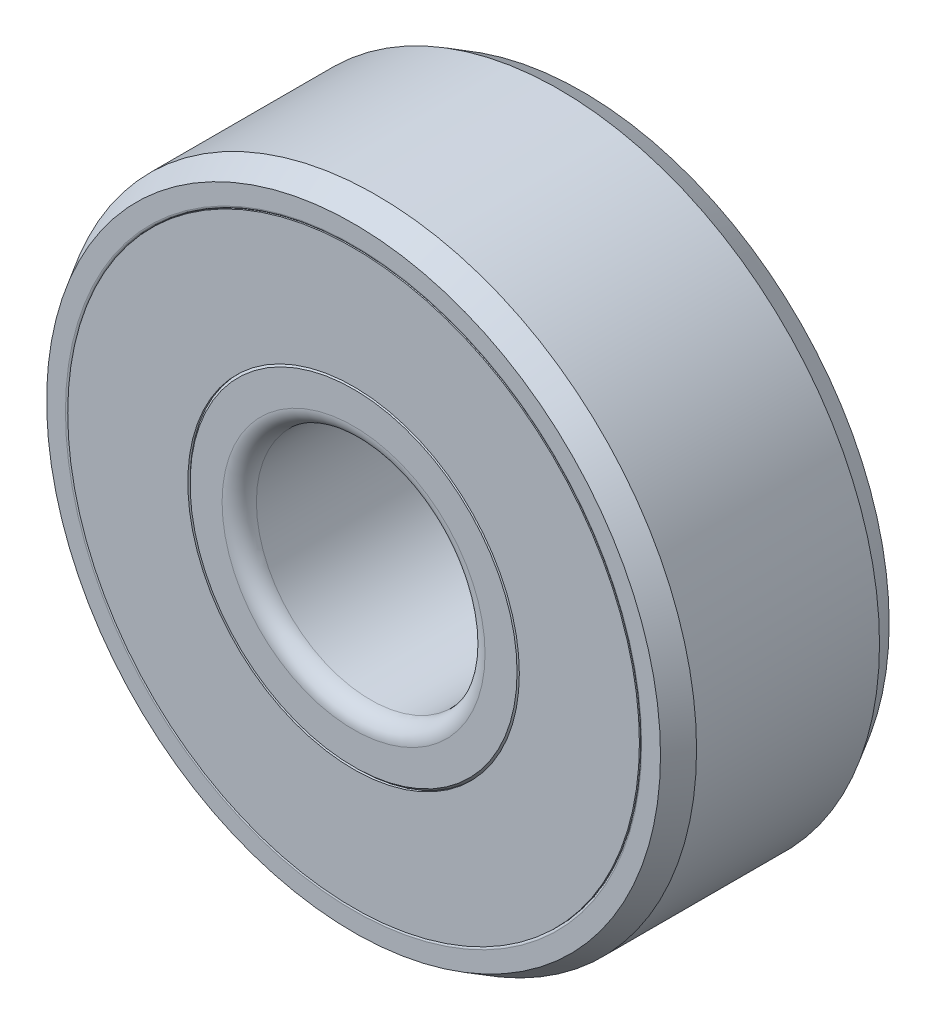
ISO-10303-21;
HEADER;
FILE_DESCRIPTION(('STEP AP214'),'2;1');
FILE_NAME('part.step','',(''),(''),'','','');
FILE_SCHEMA(('AUTOMOTIVE_DESIGN { 1 0 10303 214 1 1 1 1 }'));
ENDSEC;
DATA;
#1=APPLICATION_CONTEXT('core data for automotive mechanical design processes');
#2=APPLICATION_PROTOCOL_DEFINITION('international standard','automotive_design',2000,#1);
#3=PRODUCT_CONTEXT('',#1,'mechanical');
#4=PRODUCT('Part','Part','',(#3));
#5=PRODUCT_RELATED_PRODUCT_CATEGORY('part','',(#4));
#6=PRODUCT_DEFINITION_FORMATION('','',#4);
#7=PRODUCT_DEFINITION_CONTEXT('part definition',#1,'design');
#8=PRODUCT_DEFINITION('design','',#6,#7);
#9=PRODUCT_DEFINITION_SHAPE('','',#8);
#10=(LENGTH_UNIT() NAMED_UNIT(*) SI_UNIT(.MILLI.,.METRE.));
#11=(NAMED_UNIT(*) PLANE_ANGLE_UNIT() SI_UNIT($,.RADIAN.));
#12=(NAMED_UNIT(*) SI_UNIT($,.STERADIAN.) SOLID_ANGLE_UNIT());
#13=UNCERTAINTY_MEASURE_WITH_UNIT(LENGTH_MEASURE(1.E-05),#10,'distance_accuracy_value','');
#14=(GEOMETRIC_REPRESENTATION_CONTEXT(3) GLOBAL_UNCERTAINTY_ASSIGNED_CONTEXT((#13)) GLOBAL_UNIT_ASSIGNED_CONTEXT((#10,
#11,#12)) REPRESENTATION_CONTEXT('',''));
#15=CARTESIAN_POINT('',(0.,0.,0.));
#16=DIRECTION('',(0.,0.,1.));
#17=DIRECTION('',(1.,0.,0.));
#18=AXIS2_PLACEMENT_3D('',#15,#16,#17);
#19=CARTESIAN_POINT('',(3.86029294468586,-3.07848089667754,0.));
#20=DIRECTION('',(-0.781831482468022,0.623489801858743,0.));
#21=DIRECTION('',(0.,0.,-1.));
#22=AXIS2_PLACEMENT_3D('',#19,#20,#21);
#23=SPHERICAL_SURFACE('',#22,1.8125);
#24=CARTESIAN_POINT('',(2.44322338271257,-1.94840563080857,0.));
#25=VERTEX_POINT('',#24);
#26=VERTEX_LOOP('',#25);
#27=FACE_BOUND('',#26,.T.);
#28=ADVANCED_FACE('F37',(#27),#23,.T.);
#29=CLOSED_SHELL('',(#28));
#30=MANIFOLD_SOLID_BREP('B2',#29);
#31=CARTESIAN_POINT('',(4.81370656639776,1.09869711140926,0.));
#32=DIRECTION('',(-0.974927912181826,-0.222520933956305,0.));
#33=DIRECTION('',(0.,0.,-1.));
#34=AXIS2_PLACEMENT_3D('',#31,#32,#33);
#35=SPHERICAL_SURFACE('',#34,1.8125);
#36=CARTESIAN_POINT('',(3.04664972556821,0.695377918613453,0.));
#37=VERTEX_POINT('',#36);
#38=VERTEX_LOOP('',#37);
#39=FACE_BOUND('',#38,.T.);
#40=ADVANCED_FACE('F55',(#39),#35,.T.);
#41=CLOSED_SHELL('',(#40));
#42=MANIFOLD_SOLID_BREP('B6',#41);
#43=CARTESIAN_POINT('',(2.14230096189298,4.44853378526818,0.));
#44=DIRECTION('',(-0.433883739117565,-0.900968867902416,0.));
#45=DIRECTION('',(0.,0.,-1.));
#46=AXIS2_PLACEMENT_3D('',#43,#44,#45);
#47=SPHERICAL_SURFACE('',#46,1.8125);
#48=CARTESIAN_POINT('',(1.35588668474239,2.81552771219505,0.));
#49=VERTEX_POINT('',#48);
#50=VERTEX_LOOP('',#49);
#51=FACE_BOUND('',#50,.T.);
#52=ADVANCED_FACE('F73',(#51),#47,.T.);
#53=CLOSED_SHELL('',(#52));
#54=MANIFOLD_SOLID_BREP('B33',#53);
#55=CARTESIAN_POINT('',(-2.14230096189292,4.44853378526821,0.));
#56=DIRECTION('',(0.433883739117553,-0.900968867902422,0.));
#57=DIRECTION('',(0.,0.,-1.));
#58=AXIS2_PLACEMENT_3D('',#55,#56,#57);
#59=SPHERICAL_SURFACE('',#58,1.8125);
#60=CARTESIAN_POINT('',(-1.35588668474235,2.81552771219507,0.));
#61=VERTEX_POINT('',#60);
#62=VERTEX_LOOP('',#61);
#63=FACE_BOUND('',#62,.T.);
#64=ADVANCED_FACE('F91',(#63),#59,.T.);
#65=CLOSED_SHELL('',(#64));
#66=MANIFOLD_SOLID_BREP('B51',#65);
#67=CARTESIAN_POINT('',(-4.81370656639775,1.09869711140932,0.));
#68=DIRECTION('',(0.974927912181823,-0.222520933956318,0.));
#69=DIRECTION('',(0.,0.,-1.));
#70=AXIS2_PLACEMENT_3D('',#67,#68,#69);
#71=SPHERICAL_SURFACE('',#70,1.8125);
#72=CARTESIAN_POINT('',(-3.0466497255682,0.695377918613495,0.));
#73=VERTEX_POINT('',#72);
#74=VERTEX_LOOP('',#73);
#75=FACE_BOUND('',#74,.T.);
#76=ADVANCED_FACE('F109',(#75),#71,.T.);
#77=CLOSED_SHELL('',(#76));
#78=MANIFOLD_SOLID_BREP('B69',#77);
#79=CARTESIAN_POINT('',(-3.8602929446859,-3.07848089667749,0.));
#80=DIRECTION('',(0.781831482468031,0.623489801858732,0.));
#81=DIRECTION('',(0.,0.,-1.));
#82=AXIS2_PLACEMENT_3D('',#79,#80,#81);
#83=SPHERICAL_SURFACE('',#82,1.8125);
#84=CARTESIAN_POINT('',(-2.4432233827126,-1.94840563080854,0.));
#85=VERTEX_POINT('',#84);
#86=VERTEX_LOOP('',#85);
#87=FACE_BOUND('',#86,.T.);
#88=ADVANCED_FACE('F127',(#87),#83,.T.);
#89=CLOSED_SHELL('',(#88));
#90=MANIFOLD_SOLID_BREP('B87',#89);
#91=CARTESIAN_POINT('',(0.,-4.9375,0.));
#92=DIRECTION('',(0.,1.,0.));
#93=DIRECTION('',(0.,0.,-1.));
#94=AXIS2_PLACEMENT_3D('',#91,#92,#93);
#95=SPHERICAL_SURFACE('',#94,1.8125);
#96=CARTESIAN_POINT('',(0.,-3.125,0.));
#97=VERTEX_POINT('',#96);
#98=VERTEX_LOOP('',#97);
#99=FACE_BOUND('',#98,.T.);
#100=ADVANCED_FACE('F147',(#99),#95,.T.);
#101=CLOSED_SHELL('',(#100));
#102=MANIFOLD_SOLID_BREP('B105',#101);
#103=CARTESIAN_POINT('',(0.,-3.625,2.5));
#104=DIRECTION('',(0.,0.,1.));
#105=DIRECTION('',(1.,0.,0.));
#106=AXIS2_PLACEMENT_3D('',#103,#104,#105);
#107=PLANE('',#106);
#108=CARTESIAN_POINT('',(0.,0.,2.5));
#109=DIRECTION('',(0.,0.,1.));
#110=DIRECTION('',(1.,0.,0.));
#111=AXIS2_PLACEMENT_3D('',#108,#109,#110);
#112=CIRCLE('',#111,6.25);
#113=CARTESIAN_POINT('',(6.25,0.,2.5));
#114=VERTEX_POINT('',#113);
#115=EDGE_CURVE('E146',#114,#114,#112,.T.);
#116=ORIENTED_EDGE('',*,*,#115,.T.);
#117=EDGE_LOOP('',(#116));
#118=FACE_BOUND('',#117,.T.);
#119=CARTESIAN_POINT('',(0.,0.,2.5));
#120=DIRECTION('',(0.,0.,1.));
#121=DIRECTION('',(1.,0.,0.));
#122=AXIS2_PLACEMENT_3D('',#119,#120,#121);
#123=CIRCLE('',#122,3.625);
#124=CARTESIAN_POINT('',(3.625,0.,2.5));
#125=VERTEX_POINT('',#124);
#126=EDGE_CURVE('E181',#125,#125,#123,.T.);
#127=ORIENTED_EDGE('',*,*,#126,.F.);
#128=EDGE_LOOP('',(#127));
#129=FACE_BOUND('',#128,.T.);
#130=ADVANCED_FACE('F167',(#118,#129),#107,.T.);
#131=CARTESIAN_POINT('',(0.,0.,2.5));
#132=DIRECTION('',(0.,0.,1.));
#133=DIRECTION('',(1.,0.,0.));
#134=AXIS2_PLACEMENT_3D('',#131,#132,#133);
#135=CYLINDRICAL_SURFACE('',#134,6.25);
#136=CARTESIAN_POINT('',(0.,0.,1.984375));
#137=DIRECTION('',(0.,0.,1.));
#138=DIRECTION('',(1.,0.,0.));
#139=AXIS2_PLACEMENT_3D('',#136,#137,#138);
#140=CIRCLE('',#139,6.25);
#141=CARTESIAN_POINT('',(6.25,0.,1.984375));
#142=VERTEX_POINT('',#141);
#143=EDGE_CURVE('E173',#142,#142,#140,.T.);
#144=ORIENTED_EDGE('',*,*,#143,.T.);
#145=EDGE_LOOP('',(#144));
#146=FACE_BOUND('',#145,.T.);
#147=ORIENTED_EDGE('',*,*,#115,.F.);
#148=EDGE_LOOP('',(#147));
#149=FACE_BOUND('',#148,.T.);
#150=ADVANCED_FACE('F191',(#146,#149),#135,.T.);
#151=CARTESIAN_POINT('',(0.,-3.625,1.984375));
#152=DIRECTION('',(0.,0.,-1.));
#153=DIRECTION('',(-1.,0.,0.));
#154=AXIS2_PLACEMENT_3D('',#151,#152,#153);
#155=PLANE('',#154);
#156=CARTESIAN_POINT('',(0.,0.,1.984375));
#157=DIRECTION('',(0.,0.,1.));
#158=DIRECTION('',(1.,0.,0.));
#159=AXIS2_PLACEMENT_3D('',#156,#157,#158);
#160=CIRCLE('',#159,3.625);
#161=CARTESIAN_POINT('',(3.625,0.,1.984375));
#162=VERTEX_POINT('',#161);
#163=EDGE_CURVE('E177',#162,#162,#160,.T.);
#164=ORIENTED_EDGE('',*,*,#163,.T.);
#165=EDGE_LOOP('',(#164));
#166=FACE_BOUND('',#165,.T.);
#167=ORIENTED_EDGE('',*,*,#143,.F.);
#168=EDGE_LOOP('',(#167));
#169=FACE_BOUND('',#168,.T.);
#170=ADVANCED_FACE('F195',(#166,#169),#155,.T.);
#171=CARTESIAN_POINT('',(0.,0.,2.5));
#172=DIRECTION('',(0.,0.,1.));
#173=DIRECTION('',(1.,0.,0.));
#174=AXIS2_PLACEMENT_3D('',#171,#172,#173);
#175=CYLINDRICAL_SURFACE('',#174,3.625);
#176=ORIENTED_EDGE('',*,*,#126,.T.);
#177=EDGE_LOOP('',(#176));
#178=FACE_BOUND('',#177,.T.);
#179=ORIENTED_EDGE('',*,*,#163,.F.);
#180=EDGE_LOOP('',(#179));
#181=FACE_BOUND('',#180,.T.);
#182=ADVANCED_FACE('F187',(#178,#181),#175,.F.);
#183=CLOSED_SHELL('',(#130,#150,#170,#182));
#184=MANIFOLD_SOLID_BREP('B123',#183);
#185=CARTESIAN_POINT('',(0.,0.,2.125));
#186=DIRECTION('',(0.,0.,1.));
#187=DIRECTION('',(1.,0.,0.));
#188=AXIS2_PLACEMENT_3D('',#185,#186,#187);
#189=TOROIDAL_SURFACE('',#188,2.875,0.375);
#190=CARTESIAN_POINT('',(0.,0.,2.5));
#191=DIRECTION('',(0.,0.,1.));
#192=DIRECTION('',(1.,0.,0.));
#193=AXIS2_PLACEMENT_3D('',#190,#191,#192);
#194=CIRCLE('',#193,2.875);
#195=CARTESIAN_POINT('',(2.875,0.,2.5));
#196=VERTEX_POINT('',#195);
#197=EDGE_CURVE('E166',#196,#196,#194,.T.);
#198=ORIENTED_EDGE('',*,*,#197,.T.);
#199=EDGE_LOOP('',(#198));
#200=FACE_BOUND('',#199,.T.);
#201=CARTESIAN_POINT('',(0.,0.,2.125));
#202=DIRECTION('',(0.,0.,1.));
#203=DIRECTION('',(1.,0.,0.));
#204=AXIS2_PLACEMENT_3D('',#201,#202,#203);
#205=CIRCLE('',#204,2.5);
#206=CARTESIAN_POINT('',(2.5,0.,2.125));
#207=VERTEX_POINT('',#206);
#208=EDGE_CURVE('E269',#207,#207,#205,.T.);
#209=ORIENTED_EDGE('',*,*,#208,.F.);
#210=EDGE_LOOP('',(#209));
#211=FACE_BOUND('',#210,.T.);
#212=ADVANCED_FACE('F235',(#200,#211),#189,.T.);
#213=CARTESIAN_POINT('',(0.,-3.575,2.5));
#214=DIRECTION('',(0.,0.,1.));
#215=DIRECTION('',(1.,0.,0.));
#216=AXIS2_PLACEMENT_3D('',#213,#214,#215);
#217=PLANE('',#216);
#218=CARTESIAN_POINT('',(0.,0.,2.5));
#219=DIRECTION('',(0.,0.,1.));
#220=DIRECTION('',(1.,0.,0.));
#221=AXIS2_PLACEMENT_3D('',#218,#219,#220);
#222=CIRCLE('',#221,3.575);
#223=CARTESIAN_POINT('',(3.575,0.,2.5));
#224=VERTEX_POINT('',#223);
#225=EDGE_CURVE('E241',#224,#224,#222,.T.);
#226=ORIENTED_EDGE('',*,*,#225,.T.);
#227=EDGE_LOOP('',(#226));
#228=FACE_BOUND('',#227,.T.);
#229=ORIENTED_EDGE('',*,*,#197,.F.);
#230=EDGE_LOOP('',(#229));
#231=FACE_BOUND('',#230,.T.);
#232=ADVANCED_FACE('F277',(#228,#231),#217,.T.);
#233=CARTESIAN_POINT('',(0.,0.,2.5));
#234=DIRECTION('',(0.,0.,-1.));
#235=DIRECTION('',(-1.,0.,0.));
#236=AXIS2_PLACEMENT_3D('',#233,#234,#235);
#237=CONICAL_SURFACE('',#236,3.575,0.785398163397453);
#238=CARTESIAN_POINT('',(0.,0.,2.45));
#239=DIRECTION('',(0.,0.,1.));
#240=DIRECTION('',(1.,0.,0.));
#241=AXIS2_PLACEMENT_3D('',#238,#239,#240);
#242=CIRCLE('',#241,3.625);
#243=CARTESIAN_POINT('',(3.625,0.,2.45));
#244=VERTEX_POINT('',#243);
#245=EDGE_CURVE('E245',#244,#244,#242,.T.);
#246=ORIENTED_EDGE('',*,*,#245,.T.);
#247=EDGE_LOOP('',(#246));
#248=FACE_BOUND('',#247,.T.);
#249=ORIENTED_EDGE('',*,*,#225,.F.);
#250=EDGE_LOOP('',(#249));
#251=FACE_BOUND('',#250,.T.);
#252=ADVANCED_FACE('F281',(#248,#251),#237,.T.);
#253=CARTESIAN_POINT('',(0.,0.,2.5));
#254=DIRECTION('',(0.,0.,1.));
#255=DIRECTION('',(1.,0.,0.));
#256=AXIS2_PLACEMENT_3D('',#253,#254,#255);
#257=CYLINDRICAL_SURFACE('',#256,3.625);
#258=CARTESIAN_POINT('',(0.,0.,1.25));
#259=DIRECTION('',(0.,0.,1.));
#260=DIRECTION('',(1.,0.,0.));
#261=AXIS2_PLACEMENT_3D('',#258,#259,#260);
#262=CIRCLE('',#261,3.625);
#263=CARTESIAN_POINT('',(3.625,0.,1.25));
#264=VERTEX_POINT('',#263);
#265=EDGE_CURVE('E249',#264,#264,#262,.T.);
#266=ORIENTED_EDGE('',*,*,#265,.T.);
#267=EDGE_LOOP('',(#266));
#268=FACE_BOUND('',#267,.T.);
#269=ORIENTED_EDGE('',*,*,#245,.F.);
#270=EDGE_LOOP('',(#269));
#271=FACE_BOUND('',#270,.T.);
#272=ADVANCED_FACE('F285',(#268,#271),#257,.T.);
#273=CARTESIAN_POINT('',(0.,0.,0.));
#274=DIRECTION('',(0.,0.,1.));
#275=DIRECTION('',(1.,0.,0.));
#276=AXIS2_PLACEMENT_3D('',#273,#274,#275);
#277=TOROIDAL_SURFACE('',#276,4.9375,1.8125);
#278=CARTESIAN_POINT('',(0.,0.,-1.25));
#279=DIRECTION('',(0.,0.,1.));
#280=DIRECTION('',(1.,0.,0.));
#281=AXIS2_PLACEMENT_3D('',#278,#279,#280);
#282=CIRCLE('',#281,3.625);
#283=CARTESIAN_POINT('',(3.625,0.,-1.25));
#284=VERTEX_POINT('',#283);
#285=EDGE_CURVE('E254',#284,#284,#282,.T.);
#286=ORIENTED_EDGE('',*,*,#285,.T.);
#287=EDGE_LOOP('',(#286));
#288=FACE_BOUND('',#287,.T.);
#289=ORIENTED_EDGE('',*,*,#265,.F.);
#290=EDGE_LOOP('',(#289));
#291=FACE_BOUND('',#290,.T.);
#292=ADVANCED_FACE('F292',(#288,#291),#277,.F.);
#293=CARTESIAN_POINT('',(0.,0.,2.5));
#294=DIRECTION('',(0.,0.,1.));
#295=DIRECTION('',(1.,0.,0.));
#296=AXIS2_PLACEMENT_3D('',#293,#294,#295);
#297=CYLINDRICAL_SURFACE('',#296,3.625);
#298=CARTESIAN_POINT('',(0.,0.,-2.45));
#299=DIRECTION('',(0.,0.,1.));
#300=DIRECTION('',(1.,0.,0.));
#301=AXIS2_PLACEMENT_3D('',#298,#299,#300);
#302=CIRCLE('',#301,3.625);
#303=CARTESIAN_POINT('',(3.625,0.,-2.45));
#304=VERTEX_POINT('',#303);
#305=EDGE_CURVE('E257',#304,#304,#302,.T.);
#306=ORIENTED_EDGE('',*,*,#305,.T.);
#307=EDGE_LOOP('',(#306));
#308=FACE_BOUND('',#307,.T.);
#309=ORIENTED_EDGE('',*,*,#285,.F.);
#310=EDGE_LOOP('',(#309));
#311=FACE_BOUND('',#310,.T.);
#312=ADVANCED_FACE('F296',(#308,#311),#297,.T.);
#313=CARTESIAN_POINT('',(0.,0.,-2.45));
#314=DIRECTION('',(0.,0.,1.));
#315=DIRECTION('',(1.,0.,0.));
#316=AXIS2_PLACEMENT_3D('',#313,#314,#315);
#317=CONICAL_SURFACE('',#316,3.625,0.785398163397453);
#318=CARTESIAN_POINT('',(0.,0.,-2.5));
#319=DIRECTION('',(0.,0.,1.));
#320=DIRECTION('',(1.,0.,0.));
#321=AXIS2_PLACEMENT_3D('',#318,#319,#320);
#322=CIRCLE('',#321,3.575);
#323=CARTESIAN_POINT('',(3.575,0.,-2.5));
#324=VERTEX_POINT('',#323);
#325=EDGE_CURVE('E260',#324,#324,#322,.T.);
#326=ORIENTED_EDGE('',*,*,#325,.T.);
#327=EDGE_LOOP('',(#326));
#328=FACE_BOUND('',#327,.T.);
#329=ORIENTED_EDGE('',*,*,#305,.F.);
#330=EDGE_LOOP('',(#329));
#331=FACE_BOUND('',#330,.T.);
#332=ADVANCED_FACE('F300',(#328,#331),#317,.T.);
#333=CARTESIAN_POINT('',(0.,-3.575,-2.5));
#334=DIRECTION('',(0.,0.,-1.));
#335=DIRECTION('',(-1.,0.,0.));
#336=AXIS2_PLACEMENT_3D('',#333,#334,#335);
#337=PLANE('',#336);
#338=CARTESIAN_POINT('',(0.,0.,-2.5));
#339=DIRECTION('',(0.,0.,1.));
#340=DIRECTION('',(1.,0.,0.));
#341=AXIS2_PLACEMENT_3D('',#338,#339,#340);
#342=CIRCLE('',#341,2.875);
#343=CARTESIAN_POINT('',(2.875,0.,-2.5));
#344=VERTEX_POINT('',#343);
#345=EDGE_CURVE('E263',#344,#344,#342,.T.);
#346=ORIENTED_EDGE('',*,*,#345,.T.);
#347=EDGE_LOOP('',(#346));
#348=FACE_BOUND('',#347,.T.);
#349=ORIENTED_EDGE('',*,*,#325,.F.);
#350=EDGE_LOOP('',(#349));
#351=FACE_BOUND('',#350,.T.);
#352=ADVANCED_FACE('F304',(#348,#351),#337,.T.);
#353=CARTESIAN_POINT('',(0.,0.,-2.125));
#354=DIRECTION('',(0.,0.,1.));
#355=DIRECTION('',(1.,0.,0.));
#356=AXIS2_PLACEMENT_3D('',#353,#354,#355);
#357=TOROIDAL_SURFACE('',#356,2.875,0.375);
#358=CARTESIAN_POINT('',(0.,0.,-2.125));
#359=DIRECTION('',(0.,0.,1.));
#360=DIRECTION('',(1.,0.,0.));
#361=AXIS2_PLACEMENT_3D('',#358,#359,#360);
#362=CIRCLE('',#361,2.5);
#363=CARTESIAN_POINT('',(2.5,0.,-2.125));
#364=VERTEX_POINT('',#363);
#365=EDGE_CURVE('E266',#364,#364,#362,.T.);
#366=ORIENTED_EDGE('',*,*,#365,.T.);
#367=EDGE_LOOP('',(#366));
#368=FACE_BOUND('',#367,.T.);
#369=ORIENTED_EDGE('',*,*,#345,.F.);
#370=EDGE_LOOP('',(#369));
#371=FACE_BOUND('',#370,.T.);
#372=ADVANCED_FACE('F308',(#368,#371),#357,.T.);
#373=CARTESIAN_POINT('',(0.,0.,2.5));
#374=DIRECTION('',(0.,0.,1.));
#375=DIRECTION('',(1.,0.,0.));
#376=AXIS2_PLACEMENT_3D('',#373,#374,#375);
#377=CYLINDRICAL_SURFACE('',#376,2.5);
#378=ORIENTED_EDGE('',*,*,#208,.T.);
#379=EDGE_LOOP('',(#378));
#380=FACE_BOUND('',#379,.T.);
#381=ORIENTED_EDGE('',*,*,#365,.F.);
#382=EDGE_LOOP('',(#381));
#383=FACE_BOUND('',#382,.T.);
#384=ADVANCED_FACE('F273',(#380,#383),#377,.F.);
#385=CLOSED_SHELL('',(#212,#232,#252,#272,#292,#312,#332,#352,#372,#384));
#386=MANIFOLD_SOLID_BREP('B141',#385);
#387=CARTESIAN_POINT('',(0.,0.,2.5));
#388=DIRECTION('',(0.,0.,-1.));
#389=DIRECTION('',(-1.,0.,0.));
#390=AXIS2_PLACEMENT_3D('',#387,#388,#389);
#391=CONICAL_SURFACE('',#390,6.7113248654052,0.523598775598279);
#392=CARTESIAN_POINT('',(0.,0.,2.));
#393=DIRECTION('',(0.,0.,1.));
#394=DIRECTION('',(1.,0.,0.));
#395=AXIS2_PLACEMENT_3D('',#392,#393,#394);
#396=CIRCLE('',#395,7.);
#397=CARTESIAN_POINT('',(7.,0.,2.));
#398=VERTEX_POINT('',#397);
#399=EDGE_CURVE('E234',#398,#398,#396,.T.);
#400=ORIENTED_EDGE('',*,*,#399,.T.);
#401=EDGE_LOOP('',(#400));
#402=FACE_BOUND('',#401,.T.);
#403=CARTESIAN_POINT('',(0.,0.,2.5));
#404=DIRECTION('',(0.,0.,1.));
#405=DIRECTION('',(1.,0.,0.));
#406=AXIS2_PLACEMENT_3D('',#403,#404,#405);
#407=CIRCLE('',#406,6.7113248654052);
#408=CARTESIAN_POINT('',(6.7113248654052,0.,2.5));
#409=VERTEX_POINT('',#408);
#410=EDGE_CURVE('E420',#409,#409,#407,.T.);
#411=ORIENTED_EDGE('',*,*,#410,.F.);
#412=EDGE_LOOP('',(#411));
#413=FACE_BOUND('',#412,.T.);
#414=ADVANCED_FACE('F386',(#402,#413),#391,.T.);
#415=CARTESIAN_POINT('',(0.,0.,2.5));
#416=DIRECTION('',(0.,0.,1.));
#417=DIRECTION('',(1.,0.,0.));
#418=AXIS2_PLACEMENT_3D('',#415,#416,#417);
#419=CYLINDRICAL_SURFACE('',#418,7.);
#420=CARTESIAN_POINT('',(0.,0.,-2.));
#421=DIRECTION('',(0.,0.,1.));
#422=DIRECTION('',(1.,0.,0.));
#423=AXIS2_PLACEMENT_3D('',#420,#421,#422);
#424=CIRCLE('',#423,7.);
#425=CARTESIAN_POINT('',(7.,0.,-2.));
#426=VERTEX_POINT('',#425);
#427=EDGE_CURVE('E392',#426,#426,#424,.T.);
#428=ORIENTED_EDGE('',*,*,#427,.T.);
#429=EDGE_LOOP('',(#428));
#430=FACE_BOUND('',#429,.T.);
#431=ORIENTED_EDGE('',*,*,#399,.F.);
#432=EDGE_LOOP('',(#431));
#433=FACE_BOUND('',#432,.T.);
#434=ADVANCED_FACE('F428',(#430,#433),#419,.T.);
#435=CARTESIAN_POINT('',(0.,0.,-2.));
#436=DIRECTION('',(0.,0.,1.));
#437=DIRECTION('',(1.,0.,0.));
#438=AXIS2_PLACEMENT_3D('',#435,#436,#437);
#439=CONICAL_SURFACE('',#438,7.,0.523598775598279);
#440=CARTESIAN_POINT('',(0.,0.,-2.5));
#441=DIRECTION('',(0.,0.,1.));
#442=DIRECTION('',(1.,0.,0.));
#443=AXIS2_PLACEMENT_3D('',#440,#441,#442);
#444=CIRCLE('',#443,6.7113248654052);
#445=CARTESIAN_POINT('',(6.7113248654052,0.,-2.5));
#446=VERTEX_POINT('',#445);
#447=EDGE_CURVE('E396',#446,#446,#444,.T.);
#448=ORIENTED_EDGE('',*,*,#447,.T.);
#449=EDGE_LOOP('',(#448));
#450=FACE_BOUND('',#449,.T.);
#451=ORIENTED_EDGE('',*,*,#427,.F.);
#452=EDGE_LOOP('',(#451));
#453=FACE_BOUND('',#452,.T.);
#454=ADVANCED_FACE('F432',(#450,#453),#439,.T.);
#455=CARTESIAN_POINT('',(0.,-6.3,-2.5));
#456=DIRECTION('',(0.,0.,-1.));
#457=DIRECTION('',(-1.,0.,0.));
#458=AXIS2_PLACEMENT_3D('',#455,#456,#457);
#459=PLANE('',#458);
#460=CARTESIAN_POINT('',(0.,0.,-2.5));
#461=DIRECTION('',(0.,0.,1.));
#462=DIRECTION('',(1.,0.,0.));
#463=AXIS2_PLACEMENT_3D('',#460,#461,#462);
#464=CIRCLE('',#463,6.3);
#465=CARTESIAN_POINT('',(6.3,0.,-2.5));
#466=VERTEX_POINT('',#465);
#467=EDGE_CURVE('E400',#466,#466,#464,.T.);
#468=ORIENTED_EDGE('',*,*,#467,.T.);
#469=EDGE_LOOP('',(#468));
#470=FACE_BOUND('',#469,.T.);
#471=ORIENTED_EDGE('',*,*,#447,.F.);
#472=EDGE_LOOP('',(#471));
#473=FACE_BOUND('',#472,.T.);
#474=ADVANCED_FACE('F436',(#470,#473),#459,.T.);
#475=CARTESIAN_POINT('',(0.,0.,-2.45));
#476=DIRECTION('',(0.,0.,1.));
#477=DIRECTION('',(1.,0.,0.));
#478=AXIS2_PLACEMENT_3D('',#475,#476,#477);
#479=TOROIDAL_SURFACE('',#478,6.3,0.0499999999999997);
#480=CARTESIAN_POINT('',(0.,0.,-2.45));
#481=DIRECTION('',(0.,0.,1.));
#482=DIRECTION('',(1.,0.,0.));
#483=AXIS2_PLACEMENT_3D('',#480,#481,#482);
#484=CIRCLE('',#483,6.25);
#485=CARTESIAN_POINT('',(6.25,0.,-2.45));
#486=VERTEX_POINT('',#485);
#487=EDGE_CURVE('E405',#486,#486,#484,.T.);
#488=ORIENTED_EDGE('',*,*,#487,.T.);
#489=EDGE_LOOP('',(#488));
#490=FACE_BOUND('',#489,.T.);
#491=ORIENTED_EDGE('',*,*,#467,.F.);
#492=EDGE_LOOP('',(#491));
#493=FACE_BOUND('',#492,.T.);
#494=ADVANCED_FACE('F443',(#490,#493),#479,.T.);
#495=CARTESIAN_POINT('',(0.,0.,2.5));
#496=DIRECTION('',(0.,0.,1.));
#497=DIRECTION('',(1.,0.,0.));
#498=AXIS2_PLACEMENT_3D('',#495,#496,#497);
#499=CYLINDRICAL_SURFACE('',#498,6.25);
#500=CARTESIAN_POINT('',(0.,0.,-1.25));
#501=DIRECTION('',(0.,0.,1.));
#502=DIRECTION('',(1.,0.,0.));
#503=AXIS2_PLACEMENT_3D('',#500,#501,#502);
#504=CIRCLE('',#503,6.25);
#505=CARTESIAN_POINT('',(6.25,0.,-1.25));
#506=VERTEX_POINT('',#505);
#507=EDGE_CURVE('E408',#506,#506,#504,.T.);
#508=ORIENTED_EDGE('',*,*,#507,.T.);
#509=EDGE_LOOP('',(#508));
#510=FACE_BOUND('',#509,.T.);
#511=ORIENTED_EDGE('',*,*,#487,.F.);
#512=EDGE_LOOP('',(#511));
#513=FACE_BOUND('',#512,.T.);
#514=ADVANCED_FACE('F447',(#510,#513),#499,.F.);
#515=CARTESIAN_POINT('',(0.,0.,0.));
#516=DIRECTION('',(0.,0.,1.));
#517=DIRECTION('',(1.,0.,0.));
#518=AXIS2_PLACEMENT_3D('',#515,#516,#517);
#519=TOROIDAL_SURFACE('',#518,4.9375,1.8125);
#520=CARTESIAN_POINT('',(0.,0.,1.25));
#521=DIRECTION('',(0.,0.,1.));
#522=DIRECTION('',(1.,0.,0.));
#523=AXIS2_PLACEMENT_3D('',#520,#521,#522);
#524=CIRCLE('',#523,6.25);
#525=CARTESIAN_POINT('',(6.25,0.,1.25));
#526=VERTEX_POINT('',#525);
#527=EDGE_CURVE('E411',#526,#526,#524,.T.);
#528=ORIENTED_EDGE('',*,*,#527,.T.);
#529=EDGE_LOOP('',(#528));
#530=FACE_BOUND('',#529,.T.);
#531=ORIENTED_EDGE('',*,*,#507,.F.);
#532=EDGE_LOOP('',(#531));
#533=FACE_BOUND('',#532,.T.);
#534=ADVANCED_FACE('F451',(#530,#533),#519,.F.);
#535=CARTESIAN_POINT('',(0.,0.,2.5));
#536=DIRECTION('',(0.,0.,1.));
#537=DIRECTION('',(1.,0.,0.));
#538=AXIS2_PLACEMENT_3D('',#535,#536,#537);
#539=CYLINDRICAL_SURFACE('',#538,6.25);
#540=CARTESIAN_POINT('',(0.,0.,2.45));
#541=DIRECTION('',(0.,0.,1.));
#542=DIRECTION('',(1.,0.,0.));
#543=AXIS2_PLACEMENT_3D('',#540,#541,#542);
#544=CIRCLE('',#543,6.25);
#545=CARTESIAN_POINT('',(6.25,0.,2.45));
#546=VERTEX_POINT('',#545);
#547=EDGE_CURVE('E414',#546,#546,#544,.T.);
#548=ORIENTED_EDGE('',*,*,#547,.T.);
#549=EDGE_LOOP('',(#548));
#550=FACE_BOUND('',#549,.T.);
#551=ORIENTED_EDGE('',*,*,#527,.F.);
#552=EDGE_LOOP('',(#551));
#553=FACE_BOUND('',#552,.T.);
#554=ADVANCED_FACE('F455',(#550,#553),#539,.F.);
#555=CARTESIAN_POINT('',(0.,0.,2.45));
#556=DIRECTION('',(0.,0.,1.));
#557=DIRECTION('',(1.,0.,0.));
#558=AXIS2_PLACEMENT_3D('',#555,#556,#557);
#559=TOROIDAL_SURFACE('',#558,6.3,0.0499999999999997);
#560=CARTESIAN_POINT('',(0.,0.,2.5));
#561=DIRECTION('',(0.,0.,1.));
#562=DIRECTION('',(1.,0.,0.));
#563=AXIS2_PLACEMENT_3D('',#560,#561,#562);
#564=CIRCLE('',#563,6.3);
#565=CARTESIAN_POINT('',(6.3,0.,2.5));
#566=VERTEX_POINT('',#565);
#567=EDGE_CURVE('E417',#566,#566,#564,.T.);
#568=ORIENTED_EDGE('',*,*,#567,.T.);
#569=EDGE_LOOP('',(#568));
#570=FACE_BOUND('',#569,.T.);
#571=ORIENTED_EDGE('',*,*,#547,.F.);
#572=EDGE_LOOP('',(#571));
#573=FACE_BOUND('',#572,.T.);
#574=ADVANCED_FACE('F459',(#570,#573),#559,.T.);
#575=CARTESIAN_POINT('',(0.,-6.3,2.5));
#576=DIRECTION('',(0.,0.,1.));
#577=DIRECTION('',(1.,0.,0.));
#578=AXIS2_PLACEMENT_3D('',#575,#576,#577);
#579=PLANE('',#578);
#580=ORIENTED_EDGE('',*,*,#410,.T.);
#581=EDGE_LOOP('',(#580));
#582=FACE_BOUND('',#581,.T.);
#583=ORIENTED_EDGE('',*,*,#567,.F.);
#584=EDGE_LOOP('',(#583));
#585=FACE_BOUND('',#584,.T.);
#586=ADVANCED_FACE('F424',(#582,#585),#579,.T.);
#587=CLOSED_SHELL('',(#414,#434,#454,#474,#494,#514,#534,#554,#574,#586));
#588=MANIFOLD_SOLID_BREP('B161',#587);
#589=ADVANCED_BREP_SHAPE_REPRESENTATION('',(#18,#30,#42,#54,#66,#78,#90,#102,#184,#386,#588),#14);
#590=SHAPE_DEFINITION_REPRESENTATION(#9,#589);
ENDSEC;
END-ISO-10303-21;
